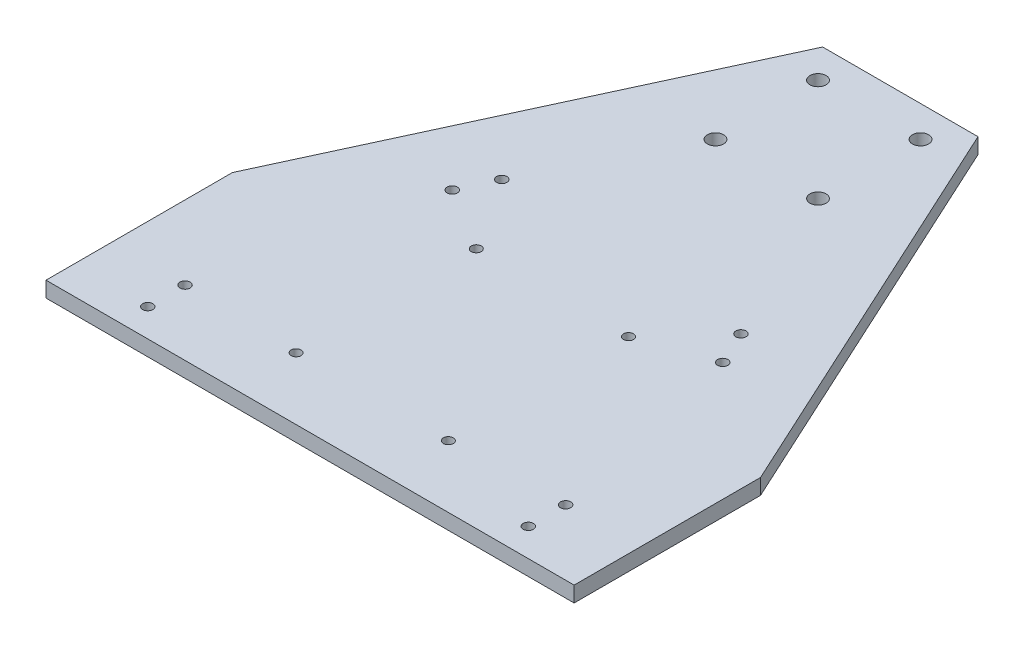
ISO-10303-21;
HEADER;
FILE_DESCRIPTION(('STEP AP214'),'2;1');
FILE_NAME('part.step','',(''),(''),'','','');
FILE_SCHEMA(('AUTOMOTIVE_DESIGN { 1 0 10303 214 1 1 1 1 }'));
ENDSEC;
DATA;
#1=APPLICATION_CONTEXT('core data for automotive mechanical design processes');
#2=APPLICATION_PROTOCOL_DEFINITION('international standard','automotive_design',2000,#1);
#3=PRODUCT_CONTEXT('',#1,'mechanical');
#4=PRODUCT('Part','Part','',(#3));
#5=PRODUCT_RELATED_PRODUCT_CATEGORY('part','',(#4));
#6=PRODUCT_DEFINITION_FORMATION('','',#4);
#7=PRODUCT_DEFINITION_CONTEXT('part definition',#1,'design');
#8=PRODUCT_DEFINITION('design','',#6,#7);
#9=PRODUCT_DEFINITION_SHAPE('','',#8);
#10=(LENGTH_UNIT() NAMED_UNIT(*) SI_UNIT(.MILLI.,.METRE.));
#11=(NAMED_UNIT(*) PLANE_ANGLE_UNIT() SI_UNIT($,.RADIAN.));
#12=(NAMED_UNIT(*) SI_UNIT($,.STERADIAN.) SOLID_ANGLE_UNIT());
#13=UNCERTAINTY_MEASURE_WITH_UNIT(LENGTH_MEASURE(1.E-05),#10,'distance_accuracy_value','');
#14=(GEOMETRIC_REPRESENTATION_CONTEXT(3) GLOBAL_UNCERTAINTY_ASSIGNED_CONTEXT((#13)) GLOBAL_UNIT_ASSIGNED_CONTEXT((#10,
#11,#12)) REPRESENTATION_CONTEXT('',''));
#15=CARTESIAN_POINT('',(0.,0.,0.));
#16=DIRECTION('',(0.,0.,1.));
#17=DIRECTION('',(1.,0.,0.));
#18=AXIS2_PLACEMENT_3D('',#15,#16,#17);
#19=CARTESIAN_POINT('',(68.5,-5.,-147.));
#20=DIRECTION('',(0.,1.,0.));
#21=DIRECTION('',(0.,0.,1.));
#22=AXIS2_PLACEMENT_3D('',#19,#20,#21);
#23=CYLINDRICAL_SURFACE('',#22,2.6);
#24=CARTESIAN_POINT('',(68.5,5.,-147.));
#25=DIRECTION('',(0.,1.,0.));
#26=DIRECTION('',(0.,0.,1.));
#27=AXIS2_PLACEMENT_3D('',#24,#25,#26);
#28=CIRCLE('',#27,2.6);
#29=CARTESIAN_POINT('',(68.5,5.,-144.4));
#30=VERTEX_POINT('',#29);
#31=EDGE_CURVE('E47',#30,#30,#28,.T.);
#32=ORIENTED_EDGE('',*,*,#31,.T.);
#33=EDGE_LOOP('',(#32));
#34=FACE_BOUND('',#33,.T.);
#35=CARTESIAN_POINT('',(68.5,0.,-147.));
#36=DIRECTION('',(0.,1.,0.));
#37=DIRECTION('',(0.,0.,1.));
#38=AXIS2_PLACEMENT_3D('',#35,#36,#37);
#39=CIRCLE('',#38,2.6);
#40=CARTESIAN_POINT('',(68.5,0.,-144.4));
#41=VERTEX_POINT('',#40);
#42=EDGE_CURVE('E11',#41,#41,#39,.T.);
#43=ORIENTED_EDGE('',*,*,#42,.F.);
#44=EDGE_LOOP('',(#43));
#45=FACE_BOUND('',#44,.T.);
#46=ADVANCED_FACE('F38',(#34,#45),#23,.F.);
#47=CARTESIAN_POINT('',(101.5,-5.,-147.));
#48=DIRECTION('',(0.,1.,0.));
#49=DIRECTION('',(0.,0.,1.));
#50=AXIS2_PLACEMENT_3D('',#47,#48,#49);
#51=CYLINDRICAL_SURFACE('',#50,2.6);
#52=CARTESIAN_POINT('',(101.5,5.,-147.));
#53=DIRECTION('',(0.,1.,0.));
#54=DIRECTION('',(0.,0.,1.));
#55=AXIS2_PLACEMENT_3D('',#52,#53,#54);
#56=CIRCLE('',#55,2.6);
#57=CARTESIAN_POINT('',(101.5,5.,-144.4));
#58=VERTEX_POINT('',#57);
#59=EDGE_CURVE('E146',#58,#58,#56,.T.);
#60=ORIENTED_EDGE('',*,*,#59,.T.);
#61=EDGE_LOOP('',(#60));
#62=FACE_BOUND('',#61,.T.);
#63=CARTESIAN_POINT('',(101.5,0.,-147.));
#64=DIRECTION('',(0.,1.,0.));
#65=DIRECTION('',(0.,0.,1.));
#66=AXIS2_PLACEMENT_3D('',#63,#64,#65);
#67=CIRCLE('',#66,2.6);
#68=CARTESIAN_POINT('',(101.5,0.,-144.4));
#69=VERTEX_POINT('',#68);
#70=EDGE_CURVE('E154',#69,#69,#67,.T.);
#71=ORIENTED_EDGE('',*,*,#70,.F.);
#72=EDGE_LOOP('',(#71));
#73=FACE_BOUND('',#72,.T.);
#74=ADVANCED_FACE('F244',(#62,#73),#51,.F.);
#75=CARTESIAN_POINT('',(0.,5.,0.));
#76=DIRECTION('',(1.,0.,0.));
#77=DIRECTION('',(0.,0.,-1.));
#78=AXIS2_PLACEMENT_3D('',#75,#76,#77);
#79=PLANE('',#78);
#80=DIRECTION('',(0.,0.,1.));
#81=VECTOR('',#80,1.);
#82=CARTESIAN_POINT('',(0.,0.,0.));
#83=LINE('',#82,#81);
#84=CARTESIAN_POINT('',(0.,0.,-60.));
#85=VERTEX_POINT('',#84);
#86=CARTESIAN_POINT('',(0.,0.,0.));
#87=VERTEX_POINT('',#86);
#88=EDGE_CURVE('E126',#85,#87,#83,.T.);
#89=ORIENTED_EDGE('',*,*,#88,.T.);
#90=DIRECTION('',(0.,-1.,0.));
#91=VECTOR('',#90,1.);
#92=CARTESIAN_POINT('',(0.,5.,0.));
#93=LINE('',#92,#91);
#94=CARTESIAN_POINT('',(0.,5.,0.));
#95=VERTEX_POINT('',#94);
#96=EDGE_CURVE('E144',#95,#87,#93,.T.);
#97=ORIENTED_EDGE('',*,*,#96,.F.);
#98=DIRECTION('',(0.,0.,1.));
#99=VECTOR('',#98,1.);
#100=CARTESIAN_POINT('',(0.,5.,0.));
#101=LINE('',#100,#99);
#102=CARTESIAN_POINT('',(0.,5.,-60.));
#103=VERTEX_POINT('',#102);
#104=EDGE_CURVE('E137',#103,#95,#101,.T.);
#105=ORIENTED_EDGE('',*,*,#104,.F.);
#106=DIRECTION('',(0.,-1.,0.));
#107=VECTOR('',#106,1.);
#108=CARTESIAN_POINT('',(0.,5.,-60.));
#109=LINE('',#108,#107);
#110=EDGE_CURVE('E122',#103,#85,#109,.T.);
#111=ORIENTED_EDGE('',*,*,#110,.T.);
#112=EDGE_LOOP('',(#89,#97,#105,#111));
#113=FACE_BOUND('',#112,.T.);
#114=ADVANCED_FACE('F231',(#113),#79,.F.);
#115=CARTESIAN_POINT('',(0.,5.,0.));
#116=DIRECTION('',(0.,0.,-1.));
#117=DIRECTION('',(-1.,0.,0.));
#118=AXIS2_PLACEMENT_3D('',#115,#116,#117);
#119=PLANE('',#118);
#120=DIRECTION('',(1.,0.,0.));
#121=VECTOR('',#120,1.);
#122=CARTESIAN_POINT('',(0.,0.,0.));
#123=LINE('',#122,#121);
#124=CARTESIAN_POINT('',(170.,0.,0.));
#125=VERTEX_POINT('',#124);
#126=EDGE_CURVE('E129',#87,#125,#123,.T.);
#127=ORIENTED_EDGE('',*,*,#126,.T.);
#128=DIRECTION('',(0.,-1.,0.));
#129=VECTOR('',#128,1.);
#130=CARTESIAN_POINT('',(170.,5.,0.));
#131=LINE('',#130,#129);
#132=CARTESIAN_POINT('',(170.,5.,0.));
#133=VERTEX_POINT('',#132);
#134=EDGE_CURVE('E141',#133,#125,#131,.T.);
#135=ORIENTED_EDGE('',*,*,#134,.F.);
#136=DIRECTION('',(1.,0.,0.));
#137=VECTOR('',#136,1.);
#138=CARTESIAN_POINT('',(0.,5.,0.));
#139=LINE('',#138,#137);
#140=EDGE_CURVE('E94',#95,#133,#139,.T.);
#141=ORIENTED_EDGE('',*,*,#140,.F.);
#142=ORIENTED_EDGE('',*,*,#96,.T.);
#143=EDGE_LOOP('',(#127,#135,#141,#142));
#144=FACE_BOUND('',#143,.T.);
#145=ADVANCED_FACE('F222',(#144),#119,.F.);
#146=CARTESIAN_POINT('',(170.,5.,0.));
#147=DIRECTION('',(-1.,0.,0.));
#148=DIRECTION('',(0.,0.,1.));
#149=AXIS2_PLACEMENT_3D('',#146,#147,#148);
#150=PLANE('',#149);
#151=DIRECTION('',(0.,0.,-1.));
#152=VECTOR('',#151,1.);
#153=CARTESIAN_POINT('',(170.,0.,0.));
#154=LINE('',#153,#152);
#155=CARTESIAN_POINT('',(170.,0.,-60.));
#156=VERTEX_POINT('',#155);
#157=EDGE_CURVE('E132',#125,#156,#154,.T.);
#158=ORIENTED_EDGE('',*,*,#157,.T.);
#159=DIRECTION('',(0.,-1.,0.));
#160=VECTOR('',#159,1.);
#161=CARTESIAN_POINT('',(170.,5.,-60.));
#162=LINE('',#161,#160);
#163=CARTESIAN_POINT('',(170.,5.,-60.));
#164=VERTEX_POINT('',#163);
#165=EDGE_CURVE('E117',#164,#156,#162,.T.);
#166=ORIENTED_EDGE('',*,*,#165,.F.);
#167=DIRECTION('',(0.,0.,-1.));
#168=VECTOR('',#167,1.);
#169=CARTESIAN_POINT('',(170.,5.,0.));
#170=LINE('',#169,#168);
#171=EDGE_CURVE('E108',#133,#164,#170,.T.);
#172=ORIENTED_EDGE('',*,*,#171,.F.);
#173=ORIENTED_EDGE('',*,*,#134,.T.);
#174=EDGE_LOOP('',(#158,#166,#172,#173));
#175=FACE_BOUND('',#174,.T.);
#176=ADVANCED_FACE('F225',(#175),#150,.F.);
#177=CARTESIAN_POINT('',(110.,5.,-190.));
#178=DIRECTION('',(-0.907959384500452,0.,0.419058177461747));
#179=DIRECTION('',(0.419058177461747,0.,0.907959384500452));
#180=AXIS2_PLACEMENT_3D('',#177,#178,#179);
#181=PLANE('',#180);
#182=DIRECTION('',(-0.419058177461747,0.,-0.907959384500452));
#183=VECTOR('',#182,1.);
#184=CARTESIAN_POINT('',(110.,0.,-190.));
#185=LINE('',#184,#183);
#186=CARTESIAN_POINT('',(110.,0.,-190.));
#187=VERTEX_POINT('',#186);
#188=EDGE_CURVE('E116',#156,#187,#185,.T.);
#189=ORIENTED_EDGE('',*,*,#188,.T.);
#190=DIRECTION('',(0.,-1.,0.));
#191=VECTOR('',#190,1.);
#192=CARTESIAN_POINT('',(110.,5.,-190.));
#193=LINE('',#192,#191);
#194=CARTESIAN_POINT('',(110.,5.,-190.));
#195=VERTEX_POINT('',#194);
#196=EDGE_CURVE('E113',#195,#187,#193,.T.);
#197=ORIENTED_EDGE('',*,*,#196,.F.);
#198=DIRECTION('',(-0.419058177461747,0.,-0.907959384500452));
#199=VECTOR('',#198,1.);
#200=CARTESIAN_POINT('',(110.,5.,-190.));
#201=LINE('',#200,#199);
#202=EDGE_CURVE('E101',#164,#195,#201,.T.);
#203=ORIENTED_EDGE('',*,*,#202,.F.);
#204=ORIENTED_EDGE('',*,*,#165,.T.);
#205=EDGE_LOOP('',(#189,#197,#203,#204));
#206=FACE_BOUND('',#205,.T.);
#207=ADVANCED_FACE('F114',(#206),#181,.F.);
#208=CARTESIAN_POINT('',(110.,5.,-190.));
#209=DIRECTION('',(0.,0.,1.));
#210=DIRECTION('',(1.,0.,0.));
#211=AXIS2_PLACEMENT_3D('',#208,#209,#210);
#212=PLANE('',#211);
#213=DIRECTION('',(-1.,0.,0.));
#214=VECTOR('',#213,1.);
#215=CARTESIAN_POINT('',(110.,0.,-190.));
#216=LINE('',#215,#214);
#217=CARTESIAN_POINT('',(60.,0.,-190.));
#218=VERTEX_POINT('',#217);
#219=EDGE_CURVE('E79',#187,#218,#216,.T.);
#220=ORIENTED_EDGE('',*,*,#219,.T.);
#221=DIRECTION('',(0.,-1.,0.));
#222=VECTOR('',#221,1.);
#223=CARTESIAN_POINT('',(60.,5.,-190.));
#224=LINE('',#223,#222);
#225=CARTESIAN_POINT('',(60.,5.,-190.));
#226=VERTEX_POINT('',#225);
#227=EDGE_CURVE('E118',#226,#218,#224,.T.);
#228=ORIENTED_EDGE('',*,*,#227,.F.);
#229=DIRECTION('',(-1.,0.,0.));
#230=VECTOR('',#229,1.);
#231=CARTESIAN_POINT('',(110.,5.,-190.));
#232=LINE('',#231,#230);
#233=EDGE_CURVE('E106',#195,#226,#232,.T.);
#234=ORIENTED_EDGE('',*,*,#233,.F.);
#235=ORIENTED_EDGE('',*,*,#196,.T.);
#236=EDGE_LOOP('',(#220,#228,#234,#235));
#237=FACE_BOUND('',#236,.T.);
#238=ADVANCED_FACE('F120',(#237),#212,.F.);
#239=CARTESIAN_POINT('',(0.,5.,-60.));
#240=DIRECTION('',(0.907959384500452,0.,0.419058177461747));
#241=DIRECTION('',(0.419058177461747,0.,-0.907959384500452));
#242=AXIS2_PLACEMENT_3D('',#239,#240,#241);
#243=PLANE('',#242);
#244=DIRECTION('',(-0.419058177461747,0.,0.907959384500452));
#245=VECTOR('',#244,1.);
#246=CARTESIAN_POINT('',(0.,0.,-60.));
#247=LINE('',#246,#245);
#248=EDGE_CURVE('E85',#218,#85,#247,.T.);
#249=ORIENTED_EDGE('',*,*,#248,.T.);
#250=ORIENTED_EDGE('',*,*,#110,.F.);
#251=DIRECTION('',(-0.419058177461747,0.,0.907959384500452));
#252=VECTOR('',#251,1.);
#253=CARTESIAN_POINT('',(0.,5.,-60.));
#254=LINE('',#253,#252);
#255=EDGE_CURVE('E56',#226,#103,#254,.T.);
#256=ORIENTED_EDGE('',*,*,#255,.F.);
#257=ORIENTED_EDGE('',*,*,#227,.T.);
#258=EDGE_LOOP('',(#249,#250,#256,#257));
#259=FACE_BOUND('',#258,.T.);
#260=ADVANCED_FACE('F232',(#259),#243,.F.);
#261=CARTESIAN_POINT('',(0.,5.,0.));
#262=DIRECTION('',(0.,1.,0.));
#263=DIRECTION('',(0.,0.,1.));
#264=AXIS2_PLACEMENT_3D('',#261,#262,#263);
#265=PLANE('',#264);
#266=CARTESIAN_POINT('',(45.274277732703,5.,-101.419560045388));
#267=DIRECTION('',(0.,1.,0.));
#268=DIRECTION('',(0.,0.,1.));
#269=AXIS2_PLACEMENT_3D('',#266,#267,#268);
#270=CIRCLE('',#269,1.65);
#271=CARTESIAN_POINT('',(45.274277732703,5.,-99.7695600453878));
#272=VERTEX_POINT('',#271);
#273=EDGE_CURVE('E356',#272,#272,#270,.T.);
#274=ORIENTED_EDGE('',*,*,#273,.F.);
#275=EDGE_LOOP('',(#274));
#276=FACE_BOUND('',#275,.T.);
#277=CARTESIAN_POINT('',(146.250000000028,5.,-8.99974372400205));
#278=DIRECTION('',(0.,1.,0.));
#279=DIRECTION('',(0.,0.,1.));
#280=AXIS2_PLACEMENT_3D('',#277,#278,#279);
#281=CIRCLE('',#280,1.64999999999999);
#282=CARTESIAN_POINT('',(146.250000000028,5.,-7.34974372400206));
#283=VERTEX_POINT('',#282);
#284=EDGE_CURVE('E360',#283,#283,#281,.T.);
#285=ORIENTED_EDGE('',*,*,#284,.F.);
#286=EDGE_LOOP('',(#285));
#287=FACE_BOUND('',#286,.T.);
#288=CARTESIAN_POINT('',(146.250000000028,5.,-20.999743724002));
#289=DIRECTION('',(0.,1.,0.));
#290=DIRECTION('',(0.,0.,1.));
#291=AXIS2_PLACEMENT_3D('',#288,#289,#290);
#292=CIRCLE('',#291,1.64999999999999);
#293=CARTESIAN_POINT('',(146.250000000028,5.,-19.349743724002));
#294=VERTEX_POINT('',#293);
#295=EDGE_CURVE('E369',#294,#294,#292,.T.);
#296=ORIENTED_EDGE('',*,*,#295,.F.);
#297=EDGE_LOOP('',(#296));
#298=FACE_BOUND('',#297,.T.);
#299=CARTESIAN_POINT('',(23.7499999999986,5.,-20.9997437240013));
#300=DIRECTION('',(0.,1.,0.));
#301=DIRECTION('',(0.,0.,1.));
#302=AXIS2_PLACEMENT_3D('',#299,#300,#301);
#303=CIRCLE('',#302,1.65);
#304=CARTESIAN_POINT('',(23.7499999999986,5.,-19.3497437240013));
#305=VERTEX_POINT('',#304);
#306=EDGE_CURVE('E371',#305,#305,#303,.T.);
#307=ORIENTED_EDGE('',*,*,#306,.F.);
#308=EDGE_LOOP('',(#307));
#309=FACE_BOUND('',#308,.T.);
#310=CARTESIAN_POINT('',(40.2455796031621,5.,-90.5240474313824));
#311=DIRECTION('',(0.,1.,0.));
#312=DIRECTION('',(0.,0.,1.));
#313=AXIS2_PLACEMENT_3D('',#310,#311,#312);
#314=CIRCLE('',#313,1.65);
#315=CARTESIAN_POINT('',(40.2455796031621,5.,-88.8740474313824));
#316=VERTEX_POINT('',#315);
#317=EDGE_CURVE('E317',#316,#316,#314,.T.);
#318=ORIENTED_EDGE('',*,*,#317,.F.);
#319=EDGE_LOOP('',(#318));
#320=FACE_BOUND('',#319,.T.);
#321=CARTESIAN_POINT('',(126.82108486931,5.,-96.8796077410265));
#322=DIRECTION('',(0.,1.,0.));
#323=DIRECTION('',(0.,0.,1.));
#324=AXIS2_PLACEMENT_3D('',#321,#322,#323);
#325=CIRCLE('',#324,1.65000000000005);
#326=CARTESIAN_POINT('',(126.82108486931,5.,-95.2296077410265));
#327=VERTEX_POINT('',#326);
#328=EDGE_CURVE('E357',#327,#327,#325,.T.);
#329=ORIENTED_EDGE('',*,*,#328,.F.);
#330=EDGE_LOOP('',(#329));
#331=FACE_BOUND('',#330,.T.);
#332=CARTESIAN_POINT('',(131.849782998851,5.,-85.9840951270211));
#333=DIRECTION('',(0.,1.,0.));
#334=DIRECTION('',(0.,0.,1.));
#335=AXIS2_PLACEMENT_3D('',#332,#333,#334);
#336=CIRCLE('',#335,1.65000000000002);
#337=CARTESIAN_POINT('',(131.849782998851,5.,-84.3340951270211));
#338=VERTEX_POINT('',#337);
#339=EDGE_CURVE('E363',#338,#338,#336,.T.);
#340=ORIENTED_EDGE('',*,*,#339,.F.);
#341=EDGE_LOOP('',(#340));
#342=FACE_BOUND('',#341,.T.);
#343=CARTESIAN_POINT('',(23.7499999999986,5.,-8.99974372400134));
#344=DIRECTION('',(0.,1.,0.));
#345=DIRECTION('',(0.,0.,1.));
#346=AXIS2_PLACEMENT_3D('',#343,#344,#345);
#347=CIRCLE('',#346,1.65);
#348=CARTESIAN_POINT('',(23.7499999999986,5.,-7.34974372400134));
#349=VERTEX_POINT('',#348);
#350=EDGE_CURVE('E163',#349,#349,#347,.T.);
#351=ORIENTED_EDGE('',*,*,#350,.F.);
#352=EDGE_LOOP('',(#351));
#353=FACE_BOUND('',#352,.T.);
#354=CARTESIAN_POINT('',(68.5,5.,-180.));
#355=DIRECTION('',(0.,1.,0.));
#356=DIRECTION('',(0.,0.,1.));
#357=AXIS2_PLACEMENT_3D('',#354,#355,#356);
#358=CIRCLE('',#357,2.6);
#359=CARTESIAN_POINT('',(68.5,5.,-177.4));
#360=VERTEX_POINT('',#359);
#361=EDGE_CURVE('E182',#360,#360,#358,.T.);
#362=ORIENTED_EDGE('',*,*,#361,.F.);
#363=EDGE_LOOP('',(#362));
#364=FACE_BOUND('',#363,.T.);
#365=CARTESIAN_POINT('',(101.5,5.,-180.));
#366=DIRECTION('',(0.,1.,0.));
#367=DIRECTION('',(0.,0.,1.));
#368=AXIS2_PLACEMENT_3D('',#365,#366,#367);
#369=CIRCLE('',#368,2.6);
#370=CARTESIAN_POINT('',(101.5,5.,-177.4));
#371=VERTEX_POINT('',#370);
#372=EDGE_CURVE('E151',#371,#371,#369,.T.);
#373=ORIENTED_EDGE('',*,*,#372,.F.);
#374=EDGE_LOOP('',(#373));
#375=FACE_BOUND('',#374,.T.);
#376=CARTESIAN_POINT('',(109.5,5.,-20.));
#377=DIRECTION('',(0.,1.,0.));
#378=DIRECTION('',(0.,0.,1.));
#379=AXIS2_PLACEMENT_3D('',#376,#377,#378);
#380=CIRCLE('',#379,1.6);
#381=CARTESIAN_POINT('',(109.5,5.,-18.4));
#382=VERTEX_POINT('',#381);
#383=EDGE_CURVE('E201',#382,#382,#380,.T.);
#384=ORIENTED_EDGE('',*,*,#383,.F.);
#385=EDGE_LOOP('',(#384));
#386=FACE_BOUND('',#385,.T.);
#387=CARTESIAN_POINT('',(60.5,5.,-78.));
#388=DIRECTION('',(0.,1.,0.));
#389=DIRECTION('',(0.,0.,1.));
#390=AXIS2_PLACEMENT_3D('',#387,#388,#389);
#391=CIRCLE('',#390,1.6);
#392=CARTESIAN_POINT('',(60.5,5.,-76.4));
#393=VERTEX_POINT('',#392);
#394=EDGE_CURVE('E207',#393,#393,#391,.T.);
#395=ORIENTED_EDGE('',*,*,#394,.F.);
#396=EDGE_LOOP('',(#395));
#397=FACE_BOUND('',#396,.T.);
#398=CARTESIAN_POINT('',(109.5,5.,-78.));
#399=DIRECTION('',(0.,1.,0.));
#400=DIRECTION('',(0.,0.,1.));
#401=AXIS2_PLACEMENT_3D('',#398,#399,#400);
#402=CIRCLE('',#401,1.6);
#403=CARTESIAN_POINT('',(109.5,5.,-76.4));
#404=VERTEX_POINT('',#403);
#405=EDGE_CURVE('E150',#404,#404,#402,.T.);
#406=ORIENTED_EDGE('',*,*,#405,.F.);
#407=EDGE_LOOP('',(#406));
#408=FACE_BOUND('',#407,.T.);
#409=CARTESIAN_POINT('',(60.5,5.,-20.));
#410=DIRECTION('',(0.,1.,0.));
#411=DIRECTION('',(0.,0.,1.));
#412=AXIS2_PLACEMENT_3D('',#409,#410,#411);
#413=CIRCLE('',#412,1.6);
#414=CARTESIAN_POINT('',(60.5,5.,-18.4));
#415=VERTEX_POINT('',#414);
#416=EDGE_CURVE('E200',#415,#415,#413,.T.);
#417=ORIENTED_EDGE('',*,*,#416,.F.);
#418=EDGE_LOOP('',(#417));
#419=FACE_BOUND('',#418,.T.);
#420=ORIENTED_EDGE('',*,*,#104,.T.);
#421=ORIENTED_EDGE('',*,*,#140,.T.);
#422=ORIENTED_EDGE('',*,*,#171,.T.);
#423=ORIENTED_EDGE('',*,*,#202,.T.);
#424=ORIENTED_EDGE('',*,*,#233,.T.);
#425=ORIENTED_EDGE('',*,*,#255,.T.);
#426=EDGE_LOOP('',(#420,#421,#422,#423,#424,#425));
#427=FACE_BOUND('',#426,.T.);
#428=ORIENTED_EDGE('',*,*,#59,.F.);
#429=EDGE_LOOP('',(#428));
#430=FACE_BOUND('',#429,.T.);
#431=ORIENTED_EDGE('',*,*,#31,.F.);
#432=EDGE_LOOP('',(#431));
#433=FACE_BOUND('',#432,.T.);
#434=ADVANCED_FACE('F103',(#276,#287,#298,#309,#320,#331,#342,#353,#364,#375,#386,#397,#408,
#419,#427,#430,#433),#265,.T.);
#435=CARTESIAN_POINT('',(0.,0.,0.));
#436=DIRECTION('',(0.,1.,0.));
#437=DIRECTION('',(0.,0.,1.));
#438=AXIS2_PLACEMENT_3D('',#435,#436,#437);
#439=PLANE('',#438);
#440=CARTESIAN_POINT('',(45.274277732703,0.,-101.419560045388));
#441=DIRECTION('',(0.,1.,0.));
#442=DIRECTION('',(0.,0.,1.));
#443=AXIS2_PLACEMENT_3D('',#440,#441,#442);
#444=CIRCLE('',#443,1.65);
#445=CARTESIAN_POINT('',(45.274277732703,0.,-99.7695600453878));
#446=VERTEX_POINT('',#445);
#447=EDGE_CURVE('E41',#446,#446,#444,.T.);
#448=ORIENTED_EDGE('',*,*,#447,.T.);
#449=EDGE_LOOP('',(#448));
#450=FACE_BOUND('',#449,.T.);
#451=CARTESIAN_POINT('',(146.250000000028,0.,-8.99974372400205));
#452=DIRECTION('',(0.,1.,0.));
#453=DIRECTION('',(0.,0.,1.));
#454=AXIS2_PLACEMENT_3D('',#451,#452,#453);
#455=CIRCLE('',#454,1.64999999999999);
#456=CARTESIAN_POINT('',(146.250000000028,0.,-7.34974372400206));
#457=VERTEX_POINT('',#456);
#458=EDGE_CURVE('E177',#457,#457,#455,.T.);
#459=ORIENTED_EDGE('',*,*,#458,.T.);
#460=EDGE_LOOP('',(#459));
#461=FACE_BOUND('',#460,.T.);
#462=CARTESIAN_POINT('',(146.250000000028,0.,-20.999743724002));
#463=DIRECTION('',(0.,1.,0.));
#464=DIRECTION('',(0.,0.,1.));
#465=AXIS2_PLACEMENT_3D('',#462,#463,#464);
#466=CIRCLE('',#465,1.64999999999999);
#467=CARTESIAN_POINT('',(146.250000000028,0.,-19.349743724002));
#468=VERTEX_POINT('',#467);
#469=EDGE_CURVE('E175',#468,#468,#466,.T.);
#470=ORIENTED_EDGE('',*,*,#469,.T.);
#471=EDGE_LOOP('',(#470));
#472=FACE_BOUND('',#471,.T.);
#473=CARTESIAN_POINT('',(23.7499999999986,0.,-20.9997437240013));
#474=DIRECTION('',(0.,1.,0.));
#475=DIRECTION('',(0.,0.,1.));
#476=AXIS2_PLACEMENT_3D('',#473,#474,#475);
#477=CIRCLE('',#476,1.65);
#478=CARTESIAN_POINT('',(23.7499999999986,0.,-19.3497437240013));
#479=VERTEX_POINT('',#478);
#480=EDGE_CURVE('E172',#479,#479,#477,.T.);
#481=ORIENTED_EDGE('',*,*,#480,.T.);
#482=EDGE_LOOP('',(#481));
#483=FACE_BOUND('',#482,.T.);
#484=CARTESIAN_POINT('',(40.2455796031621,0.,-90.5240474313824));
#485=DIRECTION('',(0.,1.,0.));
#486=DIRECTION('',(0.,0.,1.));
#487=AXIS2_PLACEMENT_3D('',#484,#485,#486);
#488=CIRCLE('',#487,1.65);
#489=CARTESIAN_POINT('',(40.2455796031621,0.,-88.8740474313824));
#490=VERTEX_POINT('',#489);
#491=EDGE_CURVE('E169',#490,#490,#488,.T.);
#492=ORIENTED_EDGE('',*,*,#491,.T.);
#493=EDGE_LOOP('',(#492));
#494=FACE_BOUND('',#493,.T.);
#495=CARTESIAN_POINT('',(126.82108486931,0.,-96.8796077410265));
#496=DIRECTION('',(0.,1.,0.));
#497=DIRECTION('',(0.,0.,1.));
#498=AXIS2_PLACEMENT_3D('',#495,#496,#497);
#499=CIRCLE('',#498,1.65000000000005);
#500=CARTESIAN_POINT('',(126.82108486931,0.,-95.2296077410265));
#501=VERTEX_POINT('',#500);
#502=EDGE_CURVE('E166',#501,#501,#499,.T.);
#503=ORIENTED_EDGE('',*,*,#502,.T.);
#504=EDGE_LOOP('',(#503));
#505=FACE_BOUND('',#504,.T.);
#506=CARTESIAN_POINT('',(131.849782998851,0.,-85.9840951270211));
#507=DIRECTION('',(0.,1.,0.));
#508=DIRECTION('',(0.,0.,1.));
#509=AXIS2_PLACEMENT_3D('',#506,#507,#508);
#510=CIRCLE('',#509,1.65000000000002);
#511=CARTESIAN_POINT('',(131.849782998851,0.,-84.3340951270211));
#512=VERTEX_POINT('',#511);
#513=EDGE_CURVE('E162',#512,#512,#510,.T.);
#514=ORIENTED_EDGE('',*,*,#513,.T.);
#515=EDGE_LOOP('',(#514));
#516=FACE_BOUND('',#515,.T.);
#517=CARTESIAN_POINT('',(23.7499999999986,0.,-8.99974372400134));
#518=DIRECTION('',(0.,1.,0.));
#519=DIRECTION('',(0.,0.,1.));
#520=AXIS2_PLACEMENT_3D('',#517,#518,#519);
#521=CIRCLE('',#520,1.65);
#522=CARTESIAN_POINT('',(23.7499999999986,0.,-7.34974372400134));
#523=VERTEX_POINT('',#522);
#524=EDGE_CURVE('E159',#523,#523,#521,.T.);
#525=ORIENTED_EDGE('',*,*,#524,.T.);
#526=EDGE_LOOP('',(#525));
#527=FACE_BOUND('',#526,.T.);
#528=CARTESIAN_POINT('',(68.5,0.,-180.));
#529=DIRECTION('',(0.,1.,0.));
#530=DIRECTION('',(0.,0.,1.));
#531=AXIS2_PLACEMENT_3D('',#528,#529,#530);
#532=CIRCLE('',#531,2.6);
#533=CARTESIAN_POINT('',(68.5,0.,-177.4));
#534=VERTEX_POINT('',#533);
#535=EDGE_CURVE('E186',#534,#534,#532,.T.);
#536=ORIENTED_EDGE('',*,*,#535,.T.);
#537=EDGE_LOOP('',(#536));
#538=FACE_BOUND('',#537,.T.);
#539=CARTESIAN_POINT('',(101.5,0.,-180.));
#540=DIRECTION('',(0.,1.,0.));
#541=DIRECTION('',(0.,0.,1.));
#542=AXIS2_PLACEMENT_3D('',#539,#540,#541);
#543=CIRCLE('',#542,2.6);
#544=CARTESIAN_POINT('',(101.5,0.,-177.4));
#545=VERTEX_POINT('',#544);
#546=EDGE_CURVE('E147',#545,#545,#543,.T.);
#547=ORIENTED_EDGE('',*,*,#546,.T.);
#548=EDGE_LOOP('',(#547));
#549=FACE_BOUND('',#548,.T.);
#550=CARTESIAN_POINT('',(109.5,0.,-20.));
#551=DIRECTION('',(0.,1.,0.));
#552=DIRECTION('',(0.,0.,1.));
#553=AXIS2_PLACEMENT_3D('',#550,#551,#552);
#554=CIRCLE('',#553,1.6);
#555=CARTESIAN_POINT('',(109.5,0.,-18.4));
#556=VERTEX_POINT('',#555);
#557=EDGE_CURVE('E197',#556,#556,#554,.T.);
#558=ORIENTED_EDGE('',*,*,#557,.T.);
#559=EDGE_LOOP('',(#558));
#560=FACE_BOUND('',#559,.T.);
#561=CARTESIAN_POINT('',(60.5,0.,-78.));
#562=DIRECTION('',(0.,1.,0.));
#563=DIRECTION('',(0.,0.,1.));
#564=AXIS2_PLACEMENT_3D('',#561,#562,#563);
#565=CIRCLE('',#564,1.6);
#566=CARTESIAN_POINT('',(60.5,0.,-76.4));
#567=VERTEX_POINT('',#566);
#568=EDGE_CURVE('E204',#567,#567,#565,.T.);
#569=ORIENTED_EDGE('',*,*,#568,.T.);
#570=EDGE_LOOP('',(#569));
#571=FACE_BOUND('',#570,.T.);
#572=CARTESIAN_POINT('',(109.5,0.,-78.));
#573=DIRECTION('',(0.,1.,0.));
#574=DIRECTION('',(0.,0.,1.));
#575=AXIS2_PLACEMENT_3D('',#572,#573,#574);
#576=CIRCLE('',#575,1.6);
#577=CARTESIAN_POINT('',(109.5,0.,-76.4));
#578=VERTEX_POINT('',#577);
#579=EDGE_CURVE('E210',#578,#578,#576,.T.);
#580=ORIENTED_EDGE('',*,*,#579,.T.);
#581=EDGE_LOOP('',(#580));
#582=FACE_BOUND('',#581,.T.);
#583=CARTESIAN_POINT('',(60.5,0.,-20.));
#584=DIRECTION('',(0.,1.,0.));
#585=DIRECTION('',(0.,0.,1.));
#586=AXIS2_PLACEMENT_3D('',#583,#584,#585);
#587=CIRCLE('',#586,1.6);
#588=CARTESIAN_POINT('',(60.5,0.,-18.4));
#589=VERTEX_POINT('',#588);
#590=EDGE_CURVE('E130',#589,#589,#587,.T.);
#591=ORIENTED_EDGE('',*,*,#590,.T.);
#592=EDGE_LOOP('',(#591));
#593=FACE_BOUND('',#592,.T.);
#594=ORIENTED_EDGE('',*,*,#88,.F.);
#595=ORIENTED_EDGE('',*,*,#248,.F.);
#596=ORIENTED_EDGE('',*,*,#219,.F.);
#597=ORIENTED_EDGE('',*,*,#188,.F.);
#598=ORIENTED_EDGE('',*,*,#157,.F.);
#599=ORIENTED_EDGE('',*,*,#126,.F.);
#600=EDGE_LOOP('',(#594,#595,#596,#597,#598,#599));
#601=FACE_BOUND('',#600,.T.);
#602=ORIENTED_EDGE('',*,*,#70,.T.);
#603=EDGE_LOOP('',(#602));
#604=FACE_BOUND('',#603,.T.);
#605=ORIENTED_EDGE('',*,*,#42,.T.);
#606=EDGE_LOOP('',(#605));
#607=FACE_BOUND('',#606,.T.);
#608=ADVANCED_FACE('F228',(#450,#461,#472,#483,#494,#505,#516,#527,#538,#549,#560,#571,#582,
#593,#601,#604,#607),#439,.F.);
#609=CARTESIAN_POINT('',(60.5,0.,-20.));
#610=DIRECTION('',(0.,1.,0.));
#611=DIRECTION('',(0.,0.,1.));
#612=AXIS2_PLACEMENT_3D('',#609,#610,#611);
#613=CYLINDRICAL_SURFACE('',#612,1.6);
#614=ORIENTED_EDGE('',*,*,#590,.F.);
#615=EDGE_LOOP('',(#614));
#616=FACE_BOUND('',#615,.T.);
#617=ORIENTED_EDGE('',*,*,#416,.T.);
#618=EDGE_LOOP('',(#617));
#619=FACE_BOUND('',#618,.T.);
#620=ADVANCED_FACE('F255',(#616,#619),#613,.F.);
#621=CARTESIAN_POINT('',(109.5,0.,-78.));
#622=DIRECTION('',(0.,1.,0.));
#623=DIRECTION('',(0.,0.,1.));
#624=AXIS2_PLACEMENT_3D('',#621,#622,#623);
#625=CYLINDRICAL_SURFACE('',#624,1.6);
#626=ORIENTED_EDGE('',*,*,#579,.F.);
#627=EDGE_LOOP('',(#626));
#628=FACE_BOUND('',#627,.T.);
#629=ORIENTED_EDGE('',*,*,#405,.T.);
#630=EDGE_LOOP('',(#629));
#631=FACE_BOUND('',#630,.T.);
#632=ADVANCED_FACE('F259',(#628,#631),#625,.F.);
#633=CARTESIAN_POINT('',(60.5,0.,-78.));
#634=DIRECTION('',(0.,1.,0.));
#635=DIRECTION('',(0.,0.,1.));
#636=AXIS2_PLACEMENT_3D('',#633,#634,#635);
#637=CYLINDRICAL_SURFACE('',#636,1.6);
#638=ORIENTED_EDGE('',*,*,#568,.F.);
#639=EDGE_LOOP('',(#638));
#640=FACE_BOUND('',#639,.T.);
#641=ORIENTED_EDGE('',*,*,#394,.T.);
#642=EDGE_LOOP('',(#641));
#643=FACE_BOUND('',#642,.T.);
#644=ADVANCED_FACE('F265',(#640,#643),#637,.F.);
#645=CARTESIAN_POINT('',(109.5,0.,-20.));
#646=DIRECTION('',(0.,1.,0.));
#647=DIRECTION('',(0.,0.,1.));
#648=AXIS2_PLACEMENT_3D('',#645,#646,#647);
#649=CYLINDRICAL_SURFACE('',#648,1.6);
#650=ORIENTED_EDGE('',*,*,#557,.F.);
#651=EDGE_LOOP('',(#650));
#652=FACE_BOUND('',#651,.T.);
#653=ORIENTED_EDGE('',*,*,#383,.T.);
#654=EDGE_LOOP('',(#653));
#655=FACE_BOUND('',#654,.T.);
#656=ADVANCED_FACE('F269',(#652,#655),#649,.F.);
#657=CARTESIAN_POINT('',(101.5,-5.,-180.));
#658=DIRECTION('',(0.,1.,0.));
#659=DIRECTION('',(0.,0.,1.));
#660=AXIS2_PLACEMENT_3D('',#657,#658,#659);
#661=CYLINDRICAL_SURFACE('',#660,2.6);
#662=ORIENTED_EDGE('',*,*,#372,.T.);
#663=EDGE_LOOP('',(#662));
#664=FACE_BOUND('',#663,.T.);
#665=ORIENTED_EDGE('',*,*,#546,.F.);
#666=EDGE_LOOP('',(#665));
#667=FACE_BOUND('',#666,.T.);
#668=ADVANCED_FACE('F273',(#664,#667),#661,.F.);
#669=CARTESIAN_POINT('',(68.5,-5.,-180.));
#670=DIRECTION('',(0.,1.,0.));
#671=DIRECTION('',(0.,0.,1.));
#672=AXIS2_PLACEMENT_3D('',#669,#670,#671);
#673=CYLINDRICAL_SURFACE('',#672,2.6);
#674=ORIENTED_EDGE('',*,*,#361,.T.);
#675=EDGE_LOOP('',(#674));
#676=FACE_BOUND('',#675,.T.);
#677=ORIENTED_EDGE('',*,*,#535,.F.);
#678=EDGE_LOOP('',(#677));
#679=FACE_BOUND('',#678,.T.);
#680=ADVANCED_FACE('F277',(#676,#679),#673,.F.);
#681=CARTESIAN_POINT('',(23.7499999999986,-5.,-8.99974372400134));
#682=DIRECTION('',(0.,1.,0.));
#683=DIRECTION('',(0.,0.,1.));
#684=AXIS2_PLACEMENT_3D('',#681,#682,#683);
#685=CYLINDRICAL_SURFACE('',#684,1.65);
#686=ORIENTED_EDGE('',*,*,#350,.T.);
#687=EDGE_LOOP('',(#686));
#688=FACE_BOUND('',#687,.T.);
#689=ORIENTED_EDGE('',*,*,#524,.F.);
#690=EDGE_LOOP('',(#689));
#691=FACE_BOUND('',#690,.T.);
#692=ADVANCED_FACE('F281',(#688,#691),#685,.F.);
#693=CARTESIAN_POINT('',(131.849782998851,-5.,-85.9840951270211));
#694=DIRECTION('',(0.,1.,0.));
#695=DIRECTION('',(0.,0.,1.));
#696=AXIS2_PLACEMENT_3D('',#693,#694,#695);
#697=CYLINDRICAL_SURFACE('',#696,1.65000000000002);
#698=ORIENTED_EDGE('',*,*,#339,.T.);
#699=EDGE_LOOP('',(#698));
#700=FACE_BOUND('',#699,.T.);
#701=ORIENTED_EDGE('',*,*,#513,.F.);
#702=EDGE_LOOP('',(#701));
#703=FACE_BOUND('',#702,.T.);
#704=ADVANCED_FACE('F284',(#700,#703),#697,.F.);
#705=CARTESIAN_POINT('',(126.82108486931,-5.,-96.8796077410265));
#706=DIRECTION('',(0.,1.,0.));
#707=DIRECTION('',(0.,0.,1.));
#708=AXIS2_PLACEMENT_3D('',#705,#706,#707);
#709=CYLINDRICAL_SURFACE('',#708,1.65000000000005);
#710=ORIENTED_EDGE('',*,*,#328,.T.);
#711=EDGE_LOOP('',(#710));
#712=FACE_BOUND('',#711,.T.);
#713=ORIENTED_EDGE('',*,*,#502,.F.);
#714=EDGE_LOOP('',(#713));
#715=FACE_BOUND('',#714,.T.);
#716=ADVANCED_FACE('F305',(#712,#715),#709,.F.);
#717=CARTESIAN_POINT('',(40.2455796031621,-5.,-90.5240474313824));
#718=DIRECTION('',(0.,1.,0.));
#719=DIRECTION('',(0.,0.,1.));
#720=AXIS2_PLACEMENT_3D('',#717,#718,#719);
#721=CYLINDRICAL_SURFACE('',#720,1.65);
#722=ORIENTED_EDGE('',*,*,#317,.T.);
#723=EDGE_LOOP('',(#722));
#724=FACE_BOUND('',#723,.T.);
#725=ORIENTED_EDGE('',*,*,#491,.F.);
#726=EDGE_LOOP('',(#725));
#727=FACE_BOUND('',#726,.T.);
#728=ADVANCED_FACE('F294',(#724,#727),#721,.F.);
#729=CARTESIAN_POINT('',(23.7499999999986,-5.,-20.9997437240013));
#730=DIRECTION('',(0.,1.,0.));
#731=DIRECTION('',(0.,0.,1.));
#732=AXIS2_PLACEMENT_3D('',#729,#730,#731);
#733=CYLINDRICAL_SURFACE('',#732,1.65);
#734=ORIENTED_EDGE('',*,*,#306,.T.);
#735=EDGE_LOOP('',(#734));
#736=FACE_BOUND('',#735,.T.);
#737=ORIENTED_EDGE('',*,*,#480,.F.);
#738=EDGE_LOOP('',(#737));
#739=FACE_BOUND('',#738,.T.);
#740=ADVANCED_FACE('F290',(#736,#739),#733,.F.);
#741=CARTESIAN_POINT('',(146.250000000028,-5.,-20.999743724002));
#742=DIRECTION('',(0.,1.,0.));
#743=DIRECTION('',(0.,0.,1.));
#744=AXIS2_PLACEMENT_3D('',#741,#742,#743);
#745=CYLINDRICAL_SURFACE('',#744,1.64999999999999);
#746=ORIENTED_EDGE('',*,*,#295,.T.);
#747=EDGE_LOOP('',(#746));
#748=FACE_BOUND('',#747,.T.);
#749=ORIENTED_EDGE('',*,*,#469,.F.);
#750=EDGE_LOOP('',(#749));
#751=FACE_BOUND('',#750,.T.);
#752=ADVANCED_FACE('F286',(#748,#751),#745,.F.);
#753=CARTESIAN_POINT('',(146.250000000028,-5.,-8.99974372400205));
#754=DIRECTION('',(0.,1.,0.));
#755=DIRECTION('',(0.,0.,1.));
#756=AXIS2_PLACEMENT_3D('',#753,#754,#755);
#757=CYLINDRICAL_SURFACE('',#756,1.64999999999999);
#758=ORIENTED_EDGE('',*,*,#284,.T.);
#759=EDGE_LOOP('',(#758));
#760=FACE_BOUND('',#759,.T.);
#761=ORIENTED_EDGE('',*,*,#458,.F.);
#762=EDGE_LOOP('',(#761));
#763=FACE_BOUND('',#762,.T.);
#764=ADVANCED_FACE('F289',(#760,#763),#757,.F.);
#765=CARTESIAN_POINT('',(45.274277732703,-5.,-101.419560045388));
#766=DIRECTION('',(0.,1.,0.));
#767=DIRECTION('',(0.,0.,1.));
#768=AXIS2_PLACEMENT_3D('',#765,#766,#767);
#769=CYLINDRICAL_SURFACE('',#768,1.65);
#770=ORIENTED_EDGE('',*,*,#273,.T.);
#771=EDGE_LOOP('',(#770));
#772=FACE_BOUND('',#771,.T.);
#773=ORIENTED_EDGE('',*,*,#447,.F.);
#774=EDGE_LOOP('',(#773));
#775=FACE_BOUND('',#774,.T.);
#776=ADVANCED_FACE('F296',(#772,#775),#769,.F.);
#777=CLOSED_SHELL('',(#46,#74,#114,#145,#176,#207,#238,#260,#434,#608,#620,#632,#644,#656,#668,
#680,#692,#704,#716,#728,#740,#752,#764,#776));
#778=MANIFOLD_SOLID_BREP('B2',#777);
#779=ADVANCED_BREP_SHAPE_REPRESENTATION('',(#18,#778),#14);
#780=SHAPE_DEFINITION_REPRESENTATION(#9,#779);
ENDSEC;
END-ISO-10303-21;
